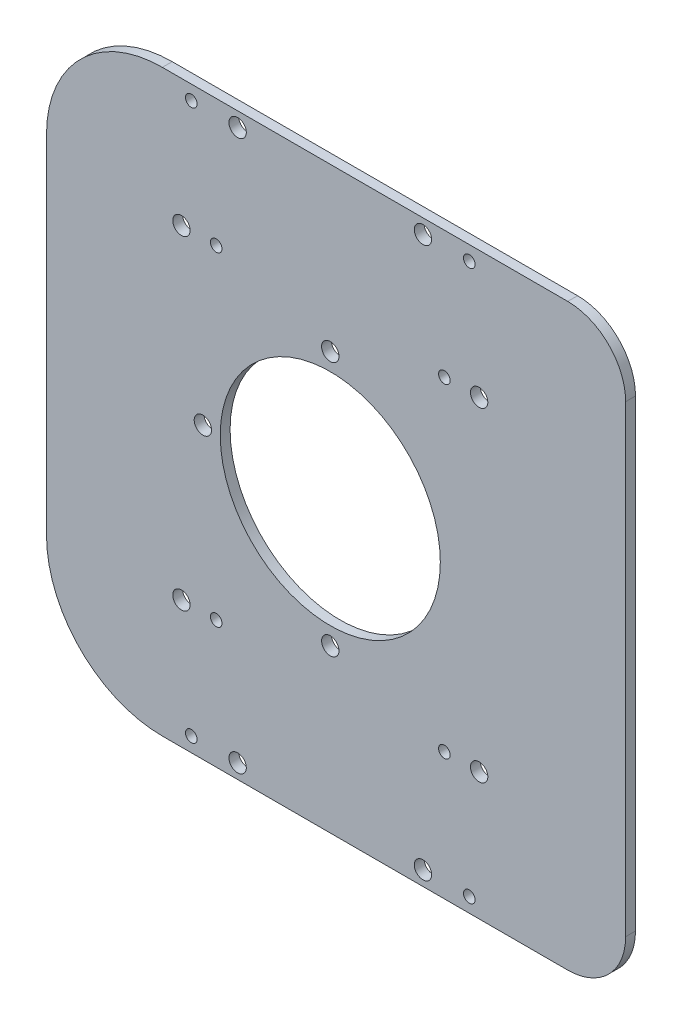
ISO-10303-21;
HEADER;
FILE_DESCRIPTION(('STEP AP214'),'2;1');
FILE_NAME('part.step','',(''),(''),'','','');
FILE_SCHEMA(('AUTOMOTIVE_DESIGN { 1 0 10303 214 1 1 1 1 }'));
ENDSEC;
DATA;
#1=APPLICATION_CONTEXT('core data for automotive mechanical design processes');
#2=APPLICATION_PROTOCOL_DEFINITION('international standard','automotive_design',2000,#1);
#3=PRODUCT_CONTEXT('',#1,'mechanical');
#4=PRODUCT('Part','Part','',(#3));
#5=PRODUCT_RELATED_PRODUCT_CATEGORY('part','',(#4));
#6=PRODUCT_DEFINITION_FORMATION('','',#4);
#7=PRODUCT_DEFINITION_CONTEXT('part definition',#1,'design');
#8=PRODUCT_DEFINITION('design','',#6,#7);
#9=PRODUCT_DEFINITION_SHAPE('','',#8);
#10=(LENGTH_UNIT() NAMED_UNIT(*) SI_UNIT(.MILLI.,.METRE.));
#11=(NAMED_UNIT(*) PLANE_ANGLE_UNIT() SI_UNIT($,.RADIAN.));
#12=(NAMED_UNIT(*) SI_UNIT($,.STERADIAN.) SOLID_ANGLE_UNIT());
#13=UNCERTAINTY_MEASURE_WITH_UNIT(LENGTH_MEASURE(1.E-05),#10,'distance_accuracy_value','');
#14=(GEOMETRIC_REPRESENTATION_CONTEXT(3) GLOBAL_UNCERTAINTY_ASSIGNED_CONTEXT((#13)) GLOBAL_UNIT_ASSIGNED_CONTEXT((#10,
#11,#12)) REPRESENTATION_CONTEXT('',''));
#15=CARTESIAN_POINT('',(0.,0.,0.));
#16=DIRECTION('',(0.,0.,1.));
#17=DIRECTION('',(1.,0.,0.));
#18=AXIS2_PLACEMENT_3D('',#15,#16,#17);
#19=CARTESIAN_POINT('',(-29.,50.,3.));
#20=DIRECTION('',(0.,-1.,0.));
#21=DIRECTION('',(0.,0.,-1.));
#22=AXIS2_PLACEMENT_3D('',#19,#20,#21);
#23=PLANE('',#22);
#24=DIRECTION('',(1.,0.,0.));
#25=VECTOR('',#24,1.);
#26=CARTESIAN_POINT('',(-29.,50.,1.3));
#27=LINE('',#26,#25);
#28=CARTESIAN_POINT('',(-29.,50.,1.3));
#29=VERTEX_POINT('',#28);
#30=CARTESIAN_POINT('',(41.,50.,1.3));
#31=VERTEX_POINT('',#30);
#32=EDGE_CURVE('E112',#29,#31,#27,.T.);
#33=ORIENTED_EDGE('',*,*,#32,.F.);
#34=DIRECTION('',(0.,0.,1.));
#35=VECTOR('',#34,1.);
#36=CARTESIAN_POINT('',(-29.,50.,3.));
#37=LINE('',#36,#35);
#38=CARTESIAN_POINT('',(-29.,50.,3.));
#39=VERTEX_POINT('',#38);
#40=EDGE_CURVE('E125',#29,#39,#37,.T.);
#41=ORIENTED_EDGE('',*,*,#40,.T.);
#42=DIRECTION('',(-1.,0.,0.));
#43=VECTOR('',#42,1.);
#44=CARTESIAN_POINT('',(-29.,50.,3.));
#45=LINE('',#44,#43);
#46=CARTESIAN_POINT('',(41.,50.,3.));
#47=VERTEX_POINT('',#46);
#48=EDGE_CURVE('E142',#47,#39,#45,.T.);
#49=ORIENTED_EDGE('',*,*,#48,.F.);
#50=DIRECTION('',(0.,0.,1.));
#51=VECTOR('',#50,1.);
#52=CARTESIAN_POINT('',(41.,50.,3.));
#53=LINE('',#52,#51);
#54=EDGE_CURVE('E53',#47,#31,#53,.F.);
#55=ORIENTED_EDGE('',*,*,#54,.T.);
#56=EDGE_LOOP('',(#33,#41,#49,#55));
#57=FACE_BOUND('',#56,.T.);
#58=ADVANCED_FACE('F44',(#57),#23,.F.);
#59=CARTESIAN_POINT('',(-29.,-50.,3.));
#60=DIRECTION('',(0.,1.,0.));
#61=DIRECTION('',(0.,0.,1.));
#62=AXIS2_PLACEMENT_3D('',#59,#60,#61);
#63=PLANE('',#62);
#64=DIRECTION('',(-1.,0.,0.));
#65=VECTOR('',#64,1.);
#66=CARTESIAN_POINT('',(41.,-50.,1.3));
#67=LINE('',#66,#65);
#68=CARTESIAN_POINT('',(41.,-50.,1.3));
#69=VERTEX_POINT('',#68);
#70=CARTESIAN_POINT('',(-29.,-50.,1.3));
#71=VERTEX_POINT('',#70);
#72=EDGE_CURVE('E191',#69,#71,#67,.T.);
#73=ORIENTED_EDGE('',*,*,#72,.F.);
#74=DIRECTION('',(0.,0.,1.));
#75=VECTOR('',#74,1.);
#76=CARTESIAN_POINT('',(41.,-50.,3.));
#77=LINE('',#76,#75);
#78=CARTESIAN_POINT('',(41.,-50.,3.));
#79=VERTEX_POINT('',#78);
#80=EDGE_CURVE('E11',#69,#79,#77,.T.);
#81=ORIENTED_EDGE('',*,*,#80,.T.);
#82=DIRECTION('',(1.,0.,0.));
#83=VECTOR('',#82,1.);
#84=CARTESIAN_POINT('',(-29.,-50.,3.));
#85=LINE('',#84,#83);
#86=CARTESIAN_POINT('',(-29.,-50.,3.));
#87=VERTEX_POINT('',#86);
#88=EDGE_CURVE('E136',#87,#79,#85,.T.);
#89=ORIENTED_EDGE('',*,*,#88,.F.);
#90=DIRECTION('',(0.,0.,1.));
#91=VECTOR('',#90,1.);
#92=CARTESIAN_POINT('',(-29.,-50.,0.));
#93=LINE('',#92,#91);
#94=EDGE_CURVE('E154',#87,#71,#93,.F.);
#95=ORIENTED_EDGE('',*,*,#94,.T.);
#96=EDGE_LOOP('',(#73,#81,#89,#95));
#97=FACE_BOUND('',#96,.T.);
#98=ADVANCED_FACE('F384',(#97),#63,.F.);
#99=CARTESIAN_POINT('',(-24.,47.5,3.));
#100=DIRECTION('',(0.,0.,-1.));
#101=DIRECTION('',(-1.,0.,0.));
#102=AXIS2_PLACEMENT_3D('',#99,#100,#101);
#103=CYLINDRICAL_SURFACE('',#102,0.999999999999998);
#104=CARTESIAN_POINT('',(-24.,47.5,3.));
#105=DIRECTION('',(0.,0.,1.));
#106=DIRECTION('',(1.,0.,0.));
#107=AXIS2_PLACEMENT_3D('',#104,#105,#106);
#108=CIRCLE('',#107,0.999999999999998);
#109=CARTESIAN_POINT('',(-23.,47.5,3.));
#110=VERTEX_POINT('',#109);
#111=EDGE_CURVE('E181',#110,#110,#108,.T.);
#112=ORIENTED_EDGE('',*,*,#111,.T.);
#113=EDGE_LOOP('',(#112));
#114=FACE_BOUND('',#113,.T.);
#115=CARTESIAN_POINT('',(-24.,47.5,1.3));
#116=DIRECTION('',(0.,0.,-1.));
#117=DIRECTION('',(-1.,0.,0.));
#118=AXIS2_PLACEMENT_3D('',#115,#116,#117);
#119=CIRCLE('',#118,0.999999999999998);
#120=CARTESIAN_POINT('',(-25.,47.5,1.3));
#121=VERTEX_POINT('',#120);
#122=EDGE_CURVE('E275',#121,#121,#119,.T.);
#123=ORIENTED_EDGE('',*,*,#122,.T.);
#124=EDGE_LOOP('',(#123));
#125=FACE_BOUND('',#124,.T.);
#126=ADVANCED_FACE('F365',(#114,#125),#103,.F.);
#127=CARTESIAN_POINT('',(-16.,47.5,3.));
#128=DIRECTION('',(0.,0.,-1.));
#129=DIRECTION('',(-1.,0.,0.));
#130=AXIS2_PLACEMENT_3D('',#127,#128,#129);
#131=CYLINDRICAL_SURFACE('',#130,1.5);
#132=CARTESIAN_POINT('',(-16.,47.5,3.));
#133=DIRECTION('',(0.,0.,1.));
#134=DIRECTION('',(1.,0.,0.));
#135=AXIS2_PLACEMENT_3D('',#132,#133,#134);
#136=CIRCLE('',#135,1.5);
#137=CARTESIAN_POINT('',(-14.5,47.5,3.));
#138=VERTEX_POINT('',#137);
#139=EDGE_CURVE('E357',#138,#138,#136,.T.);
#140=ORIENTED_EDGE('',*,*,#139,.T.);
#141=EDGE_LOOP('',(#140));
#142=FACE_BOUND('',#141,.T.);
#143=CARTESIAN_POINT('',(-16.,47.5,1.3));
#144=DIRECTION('',(0.,0.,-1.));
#145=DIRECTION('',(-1.,0.,0.));
#146=AXIS2_PLACEMENT_3D('',#143,#144,#145);
#147=CIRCLE('',#146,1.5);
#148=CARTESIAN_POINT('',(-17.5,47.5,1.3));
#149=VERTEX_POINT('',#148);
#150=EDGE_CURVE('E271',#149,#149,#147,.T.);
#151=ORIENTED_EDGE('',*,*,#150,.T.);
#152=EDGE_LOOP('',(#151));
#153=FACE_BOUND('',#152,.T.);
#154=ADVANCED_FACE('F434',(#142,#153),#131,.F.);
#155=CARTESIAN_POINT('',(-16.,-47.5,3.));
#156=DIRECTION('',(0.,0.,-1.));
#157=DIRECTION('',(-1.,0.,0.));
#158=AXIS2_PLACEMENT_3D('',#155,#156,#157);
#159=CYLINDRICAL_SURFACE('',#158,1.5);
#160=CARTESIAN_POINT('',(-16.,-47.5,3.));
#161=DIRECTION('',(0.,0.,1.));
#162=DIRECTION('',(-1.,0.,0.));
#163=AXIS2_PLACEMENT_3D('',#160,#161,#162);
#164=CIRCLE('',#163,1.5);
#165=CARTESIAN_POINT('',(-17.5,-47.5,3.));
#166=VERTEX_POINT('',#165);
#167=EDGE_CURVE('E353',#166,#166,#164,.T.);
#168=ORIENTED_EDGE('',*,*,#167,.T.);
#169=EDGE_LOOP('',(#168));
#170=FACE_BOUND('',#169,.T.);
#171=CARTESIAN_POINT('',(-16.,-47.5,1.3));
#172=DIRECTION('',(0.,0.,-1.));
#173=DIRECTION('',(-1.,0.,0.));
#174=AXIS2_PLACEMENT_3D('',#171,#172,#173);
#175=CIRCLE('',#174,1.5);
#176=CARTESIAN_POINT('',(-17.5,-47.5,1.3));
#177=VERTEX_POINT('',#176);
#178=EDGE_CURVE('E267',#177,#177,#175,.T.);
#179=ORIENTED_EDGE('',*,*,#178,.T.);
#180=EDGE_LOOP('',(#179));
#181=FACE_BOUND('',#180,.T.);
#182=ADVANCED_FACE('F442',(#170,#181),#159,.F.);
#183=CARTESIAN_POINT('',(16.,47.5,3.));
#184=DIRECTION('',(0.,0.,-1.));
#185=DIRECTION('',(-1.,0.,0.));
#186=AXIS2_PLACEMENT_3D('',#183,#184,#185);
#187=CYLINDRICAL_SURFACE('',#186,1.5);
#188=CARTESIAN_POINT('',(16.,47.5,3.));
#189=DIRECTION('',(0.,0.,1.));
#190=DIRECTION('',(-1.,0.,0.));
#191=AXIS2_PLACEMENT_3D('',#188,#189,#190);
#192=CIRCLE('',#191,1.5);
#193=CARTESIAN_POINT('',(14.5,47.5,3.));
#194=VERTEX_POINT('',#193);
#195=EDGE_CURVE('E349',#194,#194,#192,.T.);
#196=ORIENTED_EDGE('',*,*,#195,.T.);
#197=EDGE_LOOP('',(#196));
#198=FACE_BOUND('',#197,.T.);
#199=CARTESIAN_POINT('',(16.,47.5,1.3));
#200=DIRECTION('',(0.,0.,-1.));
#201=DIRECTION('',(-1.,0.,0.));
#202=AXIS2_PLACEMENT_3D('',#199,#200,#201);
#203=CIRCLE('',#202,1.5);
#204=CARTESIAN_POINT('',(14.5,47.5,1.3));
#205=VERTEX_POINT('',#204);
#206=EDGE_CURVE('E263',#205,#205,#203,.T.);
#207=ORIENTED_EDGE('',*,*,#206,.T.);
#208=EDGE_LOOP('',(#207));
#209=FACE_BOUND('',#208,.T.);
#210=ADVANCED_FACE('F452',(#198,#209),#187,.F.);
#211=CARTESIAN_POINT('',(24.,47.5,3.));
#212=DIRECTION('',(0.,0.,-1.));
#213=DIRECTION('',(-1.,0.,0.));
#214=AXIS2_PLACEMENT_3D('',#211,#212,#213);
#215=CYLINDRICAL_SURFACE('',#214,0.999999999999998);
#216=CARTESIAN_POINT('',(24.,47.5,3.));
#217=DIRECTION('',(0.,0.,1.));
#218=DIRECTION('',(-1.,0.,0.));
#219=AXIS2_PLACEMENT_3D('',#216,#217,#218);
#220=CIRCLE('',#219,0.999999999999998);
#221=CARTESIAN_POINT('',(23.,47.5,3.));
#222=VERTEX_POINT('',#221);
#223=EDGE_CURVE('E345',#222,#222,#220,.T.);
#224=ORIENTED_EDGE('',*,*,#223,.T.);
#225=EDGE_LOOP('',(#224));
#226=FACE_BOUND('',#225,.T.);
#227=CARTESIAN_POINT('',(24.,47.5,1.3));
#228=DIRECTION('',(0.,0.,-1.));
#229=DIRECTION('',(-1.,0.,0.));
#230=AXIS2_PLACEMENT_3D('',#227,#228,#229);
#231=CIRCLE('',#230,0.999999999999998);
#232=CARTESIAN_POINT('',(23.,47.5,1.3));
#233=VERTEX_POINT('',#232);
#234=EDGE_CURVE('E259',#233,#233,#231,.T.);
#235=ORIENTED_EDGE('',*,*,#234,.T.);
#236=EDGE_LOOP('',(#235));
#237=FACE_BOUND('',#236,.T.);
#238=ADVANCED_FACE('F462',(#226,#237),#215,.F.);
#239=CARTESIAN_POINT('',(-19.7,28.,3.));
#240=DIRECTION('',(0.,0.,-1.));
#241=DIRECTION('',(-1.,0.,0.));
#242=AXIS2_PLACEMENT_3D('',#239,#240,#241);
#243=CYLINDRICAL_SURFACE('',#242,1.);
#244=CARTESIAN_POINT('',(-19.7,28.,3.));
#245=DIRECTION('',(0.,0.,1.));
#246=DIRECTION('',(1.,0.,0.));
#247=AXIS2_PLACEMENT_3D('',#244,#245,#246);
#248=CIRCLE('',#247,1.);
#249=CARTESIAN_POINT('',(-18.7,28.,3.));
#250=VERTEX_POINT('',#249);
#251=EDGE_CURVE('E341',#250,#250,#248,.T.);
#252=ORIENTED_EDGE('',*,*,#251,.T.);
#253=EDGE_LOOP('',(#252));
#254=FACE_BOUND('',#253,.T.);
#255=CARTESIAN_POINT('',(-19.7,28.,1.3));
#256=DIRECTION('',(0.,0.,-1.));
#257=DIRECTION('',(-1.,0.,0.));
#258=AXIS2_PLACEMENT_3D('',#255,#256,#257);
#259=CIRCLE('',#258,1.);
#260=CARTESIAN_POINT('',(-20.7,28.,1.3));
#261=VERTEX_POINT('',#260);
#262=EDGE_CURVE('E255',#261,#261,#259,.T.);
#263=ORIENTED_EDGE('',*,*,#262,.T.);
#264=EDGE_LOOP('',(#263));
#265=FACE_BOUND('',#264,.T.);
#266=ADVANCED_FACE('F472',(#254,#265),#243,.F.);
#267=CARTESIAN_POINT('',(-25.7,28.,3.));
#268=DIRECTION('',(0.,0.,-1.));
#269=DIRECTION('',(-1.,0.,0.));
#270=AXIS2_PLACEMENT_3D('',#267,#268,#269);
#271=CYLINDRICAL_SURFACE('',#270,1.5);
#272=CARTESIAN_POINT('',(-25.7,28.,3.));
#273=DIRECTION('',(0.,0.,1.));
#274=DIRECTION('',(1.,0.,0.));
#275=AXIS2_PLACEMENT_3D('',#272,#273,#274);
#276=CIRCLE('',#275,1.5);
#277=CARTESIAN_POINT('',(-24.2,28.,3.));
#278=VERTEX_POINT('',#277);
#279=EDGE_CURVE('E337',#278,#278,#276,.T.);
#280=ORIENTED_EDGE('',*,*,#279,.T.);
#281=EDGE_LOOP('',(#280));
#282=FACE_BOUND('',#281,.T.);
#283=CARTESIAN_POINT('',(-25.7,28.,1.3));
#284=DIRECTION('',(0.,0.,-1.));
#285=DIRECTION('',(-1.,0.,0.));
#286=AXIS2_PLACEMENT_3D('',#283,#284,#285);
#287=CIRCLE('',#286,1.5);
#288=CARTESIAN_POINT('',(-27.2,28.,1.3));
#289=VERTEX_POINT('',#288);
#290=EDGE_CURVE('E251',#289,#289,#287,.T.);
#291=ORIENTED_EDGE('',*,*,#290,.T.);
#292=EDGE_LOOP('',(#291));
#293=FACE_BOUND('',#292,.T.);
#294=ADVANCED_FACE('F482',(#282,#293),#271,.F.);
#295=CARTESIAN_POINT('',(19.7,28.,3.));
#296=DIRECTION('',(0.,0.,-1.));
#297=DIRECTION('',(-1.,0.,0.));
#298=AXIS2_PLACEMENT_3D('',#295,#296,#297);
#299=CYLINDRICAL_SURFACE('',#298,1.);
#300=CARTESIAN_POINT('',(19.7,28.,3.));
#301=DIRECTION('',(0.,0.,1.));
#302=DIRECTION('',(-1.,0.,0.));
#303=AXIS2_PLACEMENT_3D('',#300,#301,#302);
#304=CIRCLE('',#303,1.);
#305=CARTESIAN_POINT('',(18.7,28.,3.));
#306=VERTEX_POINT('',#305);
#307=EDGE_CURVE('E333',#306,#306,#304,.T.);
#308=ORIENTED_EDGE('',*,*,#307,.T.);
#309=EDGE_LOOP('',(#308));
#310=FACE_BOUND('',#309,.T.);
#311=CARTESIAN_POINT('',(19.7,28.,1.3));
#312=DIRECTION('',(0.,0.,-1.));
#313=DIRECTION('',(-1.,0.,0.));
#314=AXIS2_PLACEMENT_3D('',#311,#312,#313);
#315=CIRCLE('',#314,1.);
#316=CARTESIAN_POINT('',(18.7,28.,1.3));
#317=VERTEX_POINT('',#316);
#318=EDGE_CURVE('E247',#317,#317,#315,.T.);
#319=ORIENTED_EDGE('',*,*,#318,.T.);
#320=EDGE_LOOP('',(#319));
#321=FACE_BOUND('',#320,.T.);
#322=ADVANCED_FACE('F492',(#310,#321),#299,.F.);
#323=CARTESIAN_POINT('',(25.7,28.,3.));
#324=DIRECTION('',(0.,0.,-1.));
#325=DIRECTION('',(-1.,0.,0.));
#326=AXIS2_PLACEMENT_3D('',#323,#324,#325);
#327=CYLINDRICAL_SURFACE('',#326,1.5);
#328=CARTESIAN_POINT('',(25.7,28.,3.));
#329=DIRECTION('',(0.,0.,1.));
#330=DIRECTION('',(-1.,0.,0.));
#331=AXIS2_PLACEMENT_3D('',#328,#329,#330);
#332=CIRCLE('',#331,1.5);
#333=CARTESIAN_POINT('',(24.2,28.,3.));
#334=VERTEX_POINT('',#333);
#335=EDGE_CURVE('E329',#334,#334,#332,.T.);
#336=ORIENTED_EDGE('',*,*,#335,.T.);
#337=EDGE_LOOP('',(#336));
#338=FACE_BOUND('',#337,.T.);
#339=CARTESIAN_POINT('',(25.7,28.,1.3));
#340=DIRECTION('',(0.,0.,-1.));
#341=DIRECTION('',(-1.,0.,0.));
#342=AXIS2_PLACEMENT_3D('',#339,#340,#341);
#343=CIRCLE('',#342,1.5);
#344=CARTESIAN_POINT('',(24.2,28.,1.3));
#345=VERTEX_POINT('',#344);
#346=EDGE_CURVE('E243',#345,#345,#343,.T.);
#347=ORIENTED_EDGE('',*,*,#346,.T.);
#348=EDGE_LOOP('',(#347));
#349=FACE_BOUND('',#348,.T.);
#350=ADVANCED_FACE('F502',(#338,#349),#327,.F.);
#351=CARTESIAN_POINT('',(25.7,-28.,3.));
#352=DIRECTION('',(0.,0.,-1.));
#353=DIRECTION('',(-1.,0.,0.));
#354=AXIS2_PLACEMENT_3D('',#351,#352,#353);
#355=CYLINDRICAL_SURFACE('',#354,1.5);
#356=CARTESIAN_POINT('',(25.7,-28.,3.));
#357=DIRECTION('',(0.,0.,1.));
#358=DIRECTION('',(1.,0.,0.));
#359=AXIS2_PLACEMENT_3D('',#356,#357,#358);
#360=CIRCLE('',#359,1.5);
#361=CARTESIAN_POINT('',(27.2,-28.,3.));
#362=VERTEX_POINT('',#361);
#363=EDGE_CURVE('E325',#362,#362,#360,.T.);
#364=ORIENTED_EDGE('',*,*,#363,.T.);
#365=EDGE_LOOP('',(#364));
#366=FACE_BOUND('',#365,.T.);
#367=CARTESIAN_POINT('',(25.7,-28.,1.3));
#368=DIRECTION('',(0.,0.,-1.));
#369=DIRECTION('',(-1.,0.,0.));
#370=AXIS2_PLACEMENT_3D('',#367,#368,#369);
#371=CIRCLE('',#370,1.5);
#372=CARTESIAN_POINT('',(24.2,-28.,1.3));
#373=VERTEX_POINT('',#372);
#374=EDGE_CURVE('E239',#373,#373,#371,.T.);
#375=ORIENTED_EDGE('',*,*,#374,.T.);
#376=EDGE_LOOP('',(#375));
#377=FACE_BOUND('',#376,.T.);
#378=ADVANCED_FACE('F512',(#366,#377),#355,.F.);
#379=CARTESIAN_POINT('',(24.,-47.5,3.));
#380=DIRECTION('',(0.,0.,-1.));
#381=DIRECTION('',(-1.,0.,0.));
#382=AXIS2_PLACEMENT_3D('',#379,#380,#381);
#383=CYLINDRICAL_SURFACE('',#382,0.999999999999998);
#384=CARTESIAN_POINT('',(24.,-47.5,3.));
#385=DIRECTION('',(0.,0.,1.));
#386=DIRECTION('',(1.,0.,0.));
#387=AXIS2_PLACEMENT_3D('',#384,#385,#386);
#388=CIRCLE('',#387,0.999999999999998);
#389=CARTESIAN_POINT('',(25.,-47.5,3.));
#390=VERTEX_POINT('',#389);
#391=EDGE_CURVE('E321',#390,#390,#388,.T.);
#392=ORIENTED_EDGE('',*,*,#391,.T.);
#393=EDGE_LOOP('',(#392));
#394=FACE_BOUND('',#393,.T.);
#395=CARTESIAN_POINT('',(24.,-47.5,1.3));
#396=DIRECTION('',(0.,0.,-1.));
#397=DIRECTION('',(-1.,0.,0.));
#398=AXIS2_PLACEMENT_3D('',#395,#396,#397);
#399=CIRCLE('',#398,0.999999999999998);
#400=CARTESIAN_POINT('',(23.,-47.5,1.3));
#401=VERTEX_POINT('',#400);
#402=EDGE_CURVE('E235',#401,#401,#399,.T.);
#403=ORIENTED_EDGE('',*,*,#402,.T.);
#404=EDGE_LOOP('',(#403));
#405=FACE_BOUND('',#404,.T.);
#406=ADVANCED_FACE('F522',(#394,#405),#383,.F.);
#407=CARTESIAN_POINT('',(16.,-47.5,3.));
#408=DIRECTION('',(0.,0.,-1.));
#409=DIRECTION('',(-1.,0.,0.));
#410=AXIS2_PLACEMENT_3D('',#407,#408,#409);
#411=CYLINDRICAL_SURFACE('',#410,1.5);
#412=CARTESIAN_POINT('',(16.,-47.5,3.));
#413=DIRECTION('',(0.,0.,1.));
#414=DIRECTION('',(1.,0.,0.));
#415=AXIS2_PLACEMENT_3D('',#412,#413,#414);
#416=CIRCLE('',#415,1.5);
#417=CARTESIAN_POINT('',(17.5,-47.5,3.));
#418=VERTEX_POINT('',#417);
#419=EDGE_CURVE('E317',#418,#418,#416,.T.);
#420=ORIENTED_EDGE('',*,*,#419,.T.);
#421=EDGE_LOOP('',(#420));
#422=FACE_BOUND('',#421,.T.);
#423=CARTESIAN_POINT('',(16.,-47.5,1.3));
#424=DIRECTION('',(0.,0.,-1.));
#425=DIRECTION('',(-1.,0.,0.));
#426=AXIS2_PLACEMENT_3D('',#423,#424,#425);
#427=CIRCLE('',#426,1.5);
#428=CARTESIAN_POINT('',(14.5,-47.5,1.3));
#429=VERTEX_POINT('',#428);
#430=EDGE_CURVE('E231',#429,#429,#427,.T.);
#431=ORIENTED_EDGE('',*,*,#430,.T.);
#432=EDGE_LOOP('',(#431));
#433=FACE_BOUND('',#432,.T.);
#434=ADVANCED_FACE('F532',(#422,#433),#411,.F.);
#435=CARTESIAN_POINT('',(19.7,-28.,3.));
#436=DIRECTION('',(0.,0.,-1.));
#437=DIRECTION('',(-1.,0.,0.));
#438=AXIS2_PLACEMENT_3D('',#435,#436,#437);
#439=CYLINDRICAL_SURFACE('',#438,1.);
#440=CARTESIAN_POINT('',(19.7,-28.,3.));
#441=DIRECTION('',(0.,0.,1.));
#442=DIRECTION('',(1.,0.,0.));
#443=AXIS2_PLACEMENT_3D('',#440,#441,#442);
#444=CIRCLE('',#443,1.);
#445=CARTESIAN_POINT('',(20.7,-28.,3.));
#446=VERTEX_POINT('',#445);
#447=EDGE_CURVE('E313',#446,#446,#444,.T.);
#448=ORIENTED_EDGE('',*,*,#447,.T.);
#449=EDGE_LOOP('',(#448));
#450=FACE_BOUND('',#449,.T.);
#451=CARTESIAN_POINT('',(19.7,-28.,1.3));
#452=DIRECTION('',(0.,0.,-1.));
#453=DIRECTION('',(-1.,0.,0.));
#454=AXIS2_PLACEMENT_3D('',#451,#452,#453);
#455=CIRCLE('',#454,1.);
#456=CARTESIAN_POINT('',(18.7,-28.,1.3));
#457=VERTEX_POINT('',#456);
#458=EDGE_CURVE('E227',#457,#457,#455,.T.);
#459=ORIENTED_EDGE('',*,*,#458,.T.);
#460=EDGE_LOOP('',(#459));
#461=FACE_BOUND('',#460,.T.);
#462=ADVANCED_FACE('F542',(#450,#461),#439,.F.);
#463=CARTESIAN_POINT('',(-19.7,-28.,3.));
#464=DIRECTION('',(0.,0.,-1.));
#465=DIRECTION('',(-1.,0.,0.));
#466=AXIS2_PLACEMENT_3D('',#463,#464,#465);
#467=CYLINDRICAL_SURFACE('',#466,1.);
#468=CARTESIAN_POINT('',(-19.7,-28.,3.));
#469=DIRECTION('',(0.,0.,1.));
#470=DIRECTION('',(-1.,0.,0.));
#471=AXIS2_PLACEMENT_3D('',#468,#469,#470);
#472=CIRCLE('',#471,1.);
#473=CARTESIAN_POINT('',(-20.7,-28.,3.));
#474=VERTEX_POINT('',#473);
#475=EDGE_CURVE('E309',#474,#474,#472,.T.);
#476=ORIENTED_EDGE('',*,*,#475,.T.);
#477=EDGE_LOOP('',(#476));
#478=FACE_BOUND('',#477,.T.);
#479=CARTESIAN_POINT('',(-19.7,-28.,1.3));
#480=DIRECTION('',(0.,0.,-1.));
#481=DIRECTION('',(-1.,0.,0.));
#482=AXIS2_PLACEMENT_3D('',#479,#480,#481);
#483=CIRCLE('',#482,1.);
#484=CARTESIAN_POINT('',(-20.7,-28.,1.3));
#485=VERTEX_POINT('',#484);
#486=EDGE_CURVE('E223',#485,#485,#483,.T.);
#487=ORIENTED_EDGE('',*,*,#486,.T.);
#488=EDGE_LOOP('',(#487));
#489=FACE_BOUND('',#488,.T.);
#490=ADVANCED_FACE('F552',(#478,#489),#467,.F.);
#491=CARTESIAN_POINT('',(-25.7,-28.,3.));
#492=DIRECTION('',(0.,0.,-1.));
#493=DIRECTION('',(-1.,0.,0.));
#494=AXIS2_PLACEMENT_3D('',#491,#492,#493);
#495=CYLINDRICAL_SURFACE('',#494,1.5);
#496=CARTESIAN_POINT('',(-25.7,-28.,3.));
#497=DIRECTION('',(0.,0.,1.));
#498=DIRECTION('',(-1.,0.,0.));
#499=AXIS2_PLACEMENT_3D('',#496,#497,#498);
#500=CIRCLE('',#499,1.5);
#501=CARTESIAN_POINT('',(-27.2,-28.,3.));
#502=VERTEX_POINT('',#501);
#503=EDGE_CURVE('E305',#502,#502,#500,.T.);
#504=ORIENTED_EDGE('',*,*,#503,.T.);
#505=EDGE_LOOP('',(#504));
#506=FACE_BOUND('',#505,.T.);
#507=CARTESIAN_POINT('',(-25.7,-28.,1.3));
#508=DIRECTION('',(0.,0.,-1.));
#509=DIRECTION('',(-1.,0.,0.));
#510=AXIS2_PLACEMENT_3D('',#507,#508,#509);
#511=CIRCLE('',#510,1.5);
#512=CARTESIAN_POINT('',(-27.2,-28.,1.3));
#513=VERTEX_POINT('',#512);
#514=EDGE_CURVE('E219',#513,#513,#511,.T.);
#515=ORIENTED_EDGE('',*,*,#514,.T.);
#516=EDGE_LOOP('',(#515));
#517=FACE_BOUND('',#516,.T.);
#518=ADVANCED_FACE('F562',(#506,#517),#495,.F.);
#519=CARTESIAN_POINT('',(-24.,-47.5,3.));
#520=DIRECTION('',(0.,0.,-1.));
#521=DIRECTION('',(-1.,0.,0.));
#522=AXIS2_PLACEMENT_3D('',#519,#520,#521);
#523=CYLINDRICAL_SURFACE('',#522,0.999999999999998);
#524=CARTESIAN_POINT('',(-24.,-47.5,3.));
#525=DIRECTION('',(0.,0.,1.));
#526=DIRECTION('',(-1.,0.,0.));
#527=AXIS2_PLACEMENT_3D('',#524,#525,#526);
#528=CIRCLE('',#527,0.999999999999998);
#529=CARTESIAN_POINT('',(-25.,-47.5,3.));
#530=VERTEX_POINT('',#529);
#531=EDGE_CURVE('E290',#530,#530,#528,.T.);
#532=ORIENTED_EDGE('',*,*,#531,.T.);
#533=EDGE_LOOP('',(#532));
#534=FACE_BOUND('',#533,.T.);
#535=CARTESIAN_POINT('',(-24.,-47.5,1.3));
#536=DIRECTION('',(0.,0.,-1.));
#537=DIRECTION('',(-1.,0.,0.));
#538=AXIS2_PLACEMENT_3D('',#535,#536,#537);
#539=CIRCLE('',#538,0.999999999999998);
#540=CARTESIAN_POINT('',(-25.,-47.5,1.3));
#541=VERTEX_POINT('',#540);
#542=EDGE_CURVE('E215',#541,#541,#539,.T.);
#543=ORIENTED_EDGE('',*,*,#542,.T.);
#544=EDGE_LOOP('',(#543));
#545=FACE_BOUND('',#544,.T.);
#546=ADVANCED_FACE('F572',(#534,#545),#523,.F.);
#547=CARTESIAN_POINT('',(-22.,0.,-7.));
#548=DIRECTION('',(0.,0.,1.));
#549=DIRECTION('',(1.,0.,0.));
#550=AXIS2_PLACEMENT_3D('',#547,#548,#549);
#551=CYLINDRICAL_SURFACE('',#550,1.5);
#552=CARTESIAN_POINT('',(-22.,0.,3.));
#553=DIRECTION('',(0.,0.,1.));
#554=DIRECTION('',(1.,0.,0.));
#555=AXIS2_PLACEMENT_3D('',#552,#553,#554);
#556=CIRCLE('',#555,1.5);
#557=CARTESIAN_POINT('',(-20.5,0.,3.));
#558=VERTEX_POINT('',#557);
#559=EDGE_CURVE('E291',#558,#558,#556,.T.);
#560=ORIENTED_EDGE('',*,*,#559,.T.);
#561=EDGE_LOOP('',(#560));
#562=FACE_BOUND('',#561,.T.);
#563=CARTESIAN_POINT('',(-22.,0.,1.3));
#564=DIRECTION('',(0.,0.,-1.));
#565=DIRECTION('',(-1.,0.,0.));
#566=AXIS2_PLACEMENT_3D('',#563,#564,#565);
#567=CIRCLE('',#566,1.5);
#568=CARTESIAN_POINT('',(-23.5,0.,1.3));
#569=VERTEX_POINT('',#568);
#570=EDGE_CURVE('E211',#569,#569,#567,.F.);
#571=ORIENTED_EDGE('',*,*,#570,.F.);
#572=EDGE_LOOP('',(#571));
#573=FACE_BOUND('',#572,.T.);
#574=ADVANCED_FACE('F582',(#562,#573),#551,.F.);
#575=CARTESIAN_POINT('',(0.,22.,-7.));
#576=DIRECTION('',(0.,0.,1.));
#577=DIRECTION('',(1.,0.,0.));
#578=AXIS2_PLACEMENT_3D('',#575,#576,#577);
#579=CYLINDRICAL_SURFACE('',#578,1.5);
#580=CARTESIAN_POINT('',(0.,22.,3.));
#581=DIRECTION('',(0.,0.,1.));
#582=DIRECTION('',(1.,0.,0.));
#583=AXIS2_PLACEMENT_3D('',#580,#581,#582);
#584=CIRCLE('',#583,1.5);
#585=CARTESIAN_POINT('',(1.5,22.,3.));
#586=VERTEX_POINT('',#585);
#587=EDGE_CURVE('E295',#586,#586,#584,.T.);
#588=ORIENTED_EDGE('',*,*,#587,.T.);
#589=EDGE_LOOP('',(#588));
#590=FACE_BOUND('',#589,.T.);
#591=CARTESIAN_POINT('',(0.,22.,1.3));
#592=DIRECTION('',(0.,0.,-1.));
#593=DIRECTION('',(-1.,0.,0.));
#594=AXIS2_PLACEMENT_3D('',#591,#592,#593);
#595=CIRCLE('',#594,1.5);
#596=CARTESIAN_POINT('',(-1.5,22.,1.3));
#597=VERTEX_POINT('',#596);
#598=EDGE_CURVE('E207',#597,#597,#595,.F.);
#599=ORIENTED_EDGE('',*,*,#598,.F.);
#600=EDGE_LOOP('',(#599));
#601=FACE_BOUND('',#600,.T.);
#602=ADVANCED_FACE('F592',(#590,#601),#579,.F.);
#603=CARTESIAN_POINT('',(0.,0.,-7.));
#604=DIRECTION('',(0.,0.,1.));
#605=DIRECTION('',(1.,0.,0.));
#606=AXIS2_PLACEMENT_3D('',#603,#604,#605);
#607=CYLINDRICAL_SURFACE('',#606,19.);
#608=CARTESIAN_POINT('',(0.,0.,3.));
#609=DIRECTION('',(0.,0.,1.));
#610=DIRECTION('',(1.,0.,0.));
#611=AXIS2_PLACEMENT_3D('',#608,#609,#610);
#612=CIRCLE('',#611,19.);
#613=CARTESIAN_POINT('',(19.,0.,3.));
#614=VERTEX_POINT('',#613);
#615=EDGE_CURVE('E285',#614,#614,#612,.T.);
#616=ORIENTED_EDGE('',*,*,#615,.T.);
#617=EDGE_LOOP('',(#616));
#618=FACE_BOUND('',#617,.T.);
#619=CARTESIAN_POINT('',(0.,0.,1.3));
#620=DIRECTION('',(0.,0.,-1.));
#621=DIRECTION('',(-1.,0.,0.));
#622=AXIS2_PLACEMENT_3D('',#619,#620,#621);
#623=CIRCLE('',#622,19.);
#624=CARTESIAN_POINT('',(-19.,0.,1.3));
#625=VERTEX_POINT('',#624);
#626=EDGE_CURVE('E203',#625,#625,#623,.F.);
#627=ORIENTED_EDGE('',*,*,#626,.F.);
#628=EDGE_LOOP('',(#627));
#629=FACE_BOUND('',#628,.T.);
#630=ADVANCED_FACE('F602',(#618,#629),#607,.F.);
#631=CARTESIAN_POINT('',(0.,-22.,-7.));
#632=DIRECTION('',(0.,0.,1.));
#633=DIRECTION('',(1.,0.,0.));
#634=AXIS2_PLACEMENT_3D('',#631,#632,#633);
#635=CYLINDRICAL_SURFACE('',#634,1.5);
#636=CARTESIAN_POINT('',(0.,-22.,3.));
#637=DIRECTION('',(0.,0.,1.));
#638=DIRECTION('',(1.,0.,0.));
#639=AXIS2_PLACEMENT_3D('',#636,#637,#638);
#640=CIRCLE('',#639,1.5);
#641=CARTESIAN_POINT('',(1.5,-22.,3.));
#642=VERTEX_POINT('',#641);
#643=EDGE_CURVE('E286',#642,#642,#640,.T.);
#644=ORIENTED_EDGE('',*,*,#643,.T.);
#645=EDGE_LOOP('',(#644));
#646=FACE_BOUND('',#645,.T.);
#647=CARTESIAN_POINT('',(0.,-22.,1.3));
#648=DIRECTION('',(0.,0.,-1.));
#649=DIRECTION('',(-1.,0.,0.));
#650=AXIS2_PLACEMENT_3D('',#647,#648,#649);
#651=CIRCLE('',#650,1.5);
#652=CARTESIAN_POINT('',(-1.5,-22.,1.3));
#653=VERTEX_POINT('',#652);
#654=EDGE_CURVE('E199',#653,#653,#651,.F.);
#655=ORIENTED_EDGE('',*,*,#654,.F.);
#656=EDGE_LOOP('',(#655));
#657=FACE_BOUND('',#656,.T.);
#658=ADVANCED_FACE('F612',(#646,#657),#635,.F.);
#659=CARTESIAN_POINT('',(-49.,0.,0.));
#660=DIRECTION('',(-1.,0.,0.));
#661=DIRECTION('',(0.,-1.,0.));
#662=AXIS2_PLACEMENT_3D('',#659,#660,#661);
#663=PLANE('',#662);
#664=DIRECTION('',(0.,0.,1.));
#665=VECTOR('',#664,1.);
#666=CARTESIAN_POINT('',(-49.,30.,0.));
#667=LINE('',#666,#665);
#668=CARTESIAN_POINT('',(-49.,30.,3.));
#669=VERTEX_POINT('',#668);
#670=CARTESIAN_POINT('',(-49.,30.,1.3));
#671=VERTEX_POINT('',#670);
#672=EDGE_CURVE('E151',#669,#671,#667,.F.);
#673=ORIENTED_EDGE('',*,*,#672,.T.);
#674=DIRECTION('',(0.,1.,0.));
#675=VECTOR('',#674,1.);
#676=CARTESIAN_POINT('',(-49.,-30.,1.3));
#677=LINE('',#676,#675);
#678=CARTESIAN_POINT('',(-49.,-30.,1.3));
#679=VERTEX_POINT('',#678);
#680=EDGE_CURVE('E115',#679,#671,#677,.T.);
#681=ORIENTED_EDGE('',*,*,#680,.F.);
#682=DIRECTION('',(0.,0.,1.));
#683=VECTOR('',#682,1.);
#684=CARTESIAN_POINT('',(-49.,-30.,3.));
#685=LINE('',#684,#683);
#686=CARTESIAN_POINT('',(-49.,-30.,3.));
#687=VERTEX_POINT('',#686);
#688=EDGE_CURVE('E148',#679,#687,#685,.T.);
#689=ORIENTED_EDGE('',*,*,#688,.T.);
#690=DIRECTION('',(0.,-1.,0.));
#691=VECTOR('',#690,1.);
#692=CARTESIAN_POINT('',(-49.,0.,3.));
#693=LINE('',#692,#691);
#694=EDGE_CURVE('E281',#669,#687,#693,.T.);
#695=ORIENTED_EDGE('',*,*,#694,.F.);
#696=EDGE_LOOP('',(#673,#681,#689,#695));
#697=FACE_BOUND('',#696,.T.);
#698=ADVANCED_FACE('F622',(#697),#663,.T.);
#699=CARTESIAN_POINT('',(51.,0.,0.));
#700=DIRECTION('',(-1.,0.,0.));
#701=DIRECTION('',(0.,-1.,0.));
#702=AXIS2_PLACEMENT_3D('',#699,#700,#701);
#703=PLANE('',#702);
#704=DIRECTION('',(0.,-1.,0.));
#705=VECTOR('',#704,1.);
#706=CARTESIAN_POINT('',(51.,40.,1.3));
#707=LINE('',#706,#705);
#708=CARTESIAN_POINT('',(51.,40.,1.3));
#709=VERTEX_POINT('',#708);
#710=CARTESIAN_POINT('',(51.,-40.,1.3));
#711=VERTEX_POINT('',#710);
#712=EDGE_CURVE('E60',#709,#711,#707,.T.);
#713=ORIENTED_EDGE('',*,*,#712,.F.);
#714=DIRECTION('',(0.,0.,1.));
#715=VECTOR('',#714,1.);
#716=CARTESIAN_POINT('',(51.,40.,0.));
#717=LINE('',#716,#715);
#718=CARTESIAN_POINT('',(51.,40.,3.));
#719=VERTEX_POINT('',#718);
#720=EDGE_CURVE('E162',#709,#719,#717,.T.);
#721=ORIENTED_EDGE('',*,*,#720,.T.);
#722=DIRECTION('',(0.,-1.,0.));
#723=VECTOR('',#722,1.);
#724=CARTESIAN_POINT('',(51.,0.,3.));
#725=LINE('',#724,#723);
#726=CARTESIAN_POINT('',(51.,-40.,3.));
#727=VERTEX_POINT('',#726);
#728=EDGE_CURVE('E177',#719,#727,#725,.T.);
#729=ORIENTED_EDGE('',*,*,#728,.T.);
#730=DIRECTION('',(0.,0.,1.));
#731=VECTOR('',#730,1.);
#732=CARTESIAN_POINT('',(51.,-40.,0.));
#733=LINE('',#732,#731);
#734=EDGE_CURVE('E158',#727,#711,#733,.F.);
#735=ORIENTED_EDGE('',*,*,#734,.T.);
#736=EDGE_LOOP('',(#713,#721,#729,#735));
#737=FACE_BOUND('',#736,.T.);
#738=ADVANCED_FACE('F393',(#737),#703,.F.);
#739=CARTESIAN_POINT('',(-29.,30.,3.));
#740=DIRECTION('',(0.,0.,-1.));
#741=DIRECTION('',(-1.,0.,0.));
#742=AXIS2_PLACEMENT_3D('',#739,#740,#741);
#743=CYLINDRICAL_SURFACE('',#742,20.);
#744=ORIENTED_EDGE('',*,*,#40,.F.);
#745=CARTESIAN_POINT('',(-29.,30.,1.3));
#746=DIRECTION('',(0.,0.,-1.));
#747=DIRECTION('',(-1.,0.,0.));
#748=AXIS2_PLACEMENT_3D('',#745,#746,#747);
#749=CIRCLE('',#748,20.);
#750=EDGE_CURVE('E108',#671,#29,#749,.T.);
#751=ORIENTED_EDGE('',*,*,#750,.F.);
#752=ORIENTED_EDGE('',*,*,#672,.F.);
#753=CARTESIAN_POINT('',(-29.,30.,3.));
#754=DIRECTION('',(0.,0.,1.));
#755=DIRECTION('',(1.,0.,0.));
#756=AXIS2_PLACEMENT_3D('',#753,#754,#755);
#757=CIRCLE('',#756,20.);
#758=EDGE_CURVE('E133',#39,#669,#757,.T.);
#759=ORIENTED_EDGE('',*,*,#758,.F.);
#760=EDGE_LOOP('',(#744,#751,#752,#759));
#761=FACE_BOUND('',#760,.T.);
#762=ADVANCED_FACE('F132',(#761),#743,.T.);
#763=CARTESIAN_POINT('',(-29.,-30.,0.));
#764=DIRECTION('',(0.,0.,-1.));
#765=DIRECTION('',(-1.,0.,0.));
#766=AXIS2_PLACEMENT_3D('',#763,#764,#765);
#767=CYLINDRICAL_SURFACE('',#766,20.);
#768=ORIENTED_EDGE('',*,*,#688,.F.);
#769=CARTESIAN_POINT('',(-29.,-30.,1.3));
#770=DIRECTION('',(0.,0.,-1.));
#771=DIRECTION('',(-1.,0.,0.));
#772=AXIS2_PLACEMENT_3D('',#769,#770,#771);
#773=CIRCLE('',#772,20.);
#774=EDGE_CURVE('E194',#71,#679,#773,.T.);
#775=ORIENTED_EDGE('',*,*,#774,.F.);
#776=ORIENTED_EDGE('',*,*,#94,.F.);
#777=CARTESIAN_POINT('',(-29.,-30.,3.));
#778=DIRECTION('',(0.,0.,1.));
#779=DIRECTION('',(1.,0.,0.));
#780=AXIS2_PLACEMENT_3D('',#777,#778,#779);
#781=CIRCLE('',#780,20.);
#782=EDGE_CURVE('E135',#687,#87,#781,.T.);
#783=ORIENTED_EDGE('',*,*,#782,.F.);
#784=EDGE_LOOP('',(#768,#775,#776,#783));
#785=FACE_BOUND('',#784,.T.);
#786=ADVANCED_FACE('F392',(#785),#767,.T.);
#787=CARTESIAN_POINT('',(41.,40.,0.));
#788=DIRECTION('',(0.,0.,1.));
#789=DIRECTION('',(1.,0.,0.));
#790=AXIS2_PLACEMENT_3D('',#787,#788,#789);
#791=CYLINDRICAL_SURFACE('',#790,10.);
#792=ORIENTED_EDGE('',*,*,#720,.F.);
#793=CARTESIAN_POINT('',(41.,40.,1.3));
#794=DIRECTION('',(0.,0.,-1.));
#795=DIRECTION('',(-1.,0.,0.));
#796=AXIS2_PLACEMENT_3D('',#793,#794,#795);
#797=CIRCLE('',#796,10.);
#798=EDGE_CURVE('E129',#31,#709,#797,.T.);
#799=ORIENTED_EDGE('',*,*,#798,.F.);
#800=ORIENTED_EDGE('',*,*,#54,.F.);
#801=CARTESIAN_POINT('',(41.,40.,3.));
#802=DIRECTION('',(0.,0.,1.));
#803=DIRECTION('',(1.,0.,0.));
#804=AXIS2_PLACEMENT_3D('',#801,#802,#803);
#805=CIRCLE('',#804,10.);
#806=EDGE_CURVE('E168',#719,#47,#805,.T.);
#807=ORIENTED_EDGE('',*,*,#806,.F.);
#808=EDGE_LOOP('',(#792,#799,#800,#807));
#809=FACE_BOUND('',#808,.T.);
#810=ADVANCED_FACE('F182',(#809),#791,.T.);
#811=CARTESIAN_POINT('',(41.,-40.,3.));
#812=DIRECTION('',(0.,0.,1.));
#813=DIRECTION('',(1.,0.,0.));
#814=AXIS2_PLACEMENT_3D('',#811,#812,#813);
#815=CYLINDRICAL_SURFACE('',#814,10.);
#816=ORIENTED_EDGE('',*,*,#80,.F.);
#817=CARTESIAN_POINT('',(41.,-40.,1.3));
#818=DIRECTION('',(0.,0.,-1.));
#819=DIRECTION('',(-1.,0.,0.));
#820=AXIS2_PLACEMENT_3D('',#817,#818,#819);
#821=CIRCLE('',#820,10.);
#822=EDGE_CURVE('E186',#711,#69,#821,.T.);
#823=ORIENTED_EDGE('',*,*,#822,.F.);
#824=ORIENTED_EDGE('',*,*,#734,.F.);
#825=CARTESIAN_POINT('',(41.,-40.,3.));
#826=DIRECTION('',(0.,0.,1.));
#827=DIRECTION('',(1.,0.,0.));
#828=AXIS2_PLACEMENT_3D('',#825,#826,#827);
#829=CIRCLE('',#828,10.);
#830=EDGE_CURVE('E165',#79,#727,#829,.T.);
#831=ORIENTED_EDGE('',*,*,#830,.F.);
#832=EDGE_LOOP('',(#816,#823,#824,#831));
#833=FACE_BOUND('',#832,.T.);
#834=ADVANCED_FACE('F46',(#833),#815,.T.);
#835=CARTESIAN_POINT('',(0.,0.,3.));
#836=DIRECTION('',(0.,0.,1.));
#837=DIRECTION('',(1.,0.,0.));
#838=AXIS2_PLACEMENT_3D('',#835,#836,#837);
#839=PLANE('',#838);
#840=ORIENTED_EDGE('',*,*,#643,.F.);
#841=EDGE_LOOP('',(#840));
#842=FACE_BOUND('',#841,.T.);
#843=ORIENTED_EDGE('',*,*,#615,.F.);
#844=EDGE_LOOP('',(#843));
#845=FACE_BOUND('',#844,.T.);
#846=ORIENTED_EDGE('',*,*,#587,.F.);
#847=EDGE_LOOP('',(#846));
#848=FACE_BOUND('',#847,.T.);
#849=ORIENTED_EDGE('',*,*,#559,.F.);
#850=EDGE_LOOP('',(#849));
#851=FACE_BOUND('',#850,.T.);
#852=ORIENTED_EDGE('',*,*,#503,.F.);
#853=EDGE_LOOP('',(#852));
#854=FACE_BOUND('',#853,.T.);
#855=ORIENTED_EDGE('',*,*,#447,.F.);
#856=EDGE_LOOP('',(#855));
#857=FACE_BOUND('',#856,.T.);
#858=ORIENTED_EDGE('',*,*,#391,.F.);
#859=EDGE_LOOP('',(#858));
#860=FACE_BOUND('',#859,.T.);
#861=ORIENTED_EDGE('',*,*,#335,.F.);
#862=EDGE_LOOP('',(#861));
#863=FACE_BOUND('',#862,.T.);
#864=ORIENTED_EDGE('',*,*,#279,.F.);
#865=EDGE_LOOP('',(#864));
#866=FACE_BOUND('',#865,.T.);
#867=ORIENTED_EDGE('',*,*,#223,.F.);
#868=EDGE_LOOP('',(#867));
#869=FACE_BOUND('',#868,.T.);
#870=ORIENTED_EDGE('',*,*,#167,.F.);
#871=EDGE_LOOP('',(#870));
#872=FACE_BOUND('',#871,.T.);
#873=ORIENTED_EDGE('',*,*,#111,.F.);
#874=EDGE_LOOP('',(#873));
#875=FACE_BOUND('',#874,.T.);
#876=ORIENTED_EDGE('',*,*,#728,.F.);
#877=ORIENTED_EDGE('',*,*,#806,.T.);
#878=ORIENTED_EDGE('',*,*,#48,.T.);
#879=ORIENTED_EDGE('',*,*,#758,.T.);
#880=ORIENTED_EDGE('',*,*,#694,.T.);
#881=ORIENTED_EDGE('',*,*,#782,.T.);
#882=ORIENTED_EDGE('',*,*,#88,.T.);
#883=ORIENTED_EDGE('',*,*,#830,.T.);
#884=EDGE_LOOP('',(#876,#877,#878,#879,#880,#881,#882,#883));
#885=FACE_BOUND('',#884,.T.);
#886=ORIENTED_EDGE('',*,*,#139,.F.);
#887=EDGE_LOOP('',(#886));
#888=FACE_BOUND('',#887,.T.);
#889=ORIENTED_EDGE('',*,*,#195,.F.);
#890=EDGE_LOOP('',(#889));
#891=FACE_BOUND('',#890,.T.);
#892=ORIENTED_EDGE('',*,*,#251,.F.);
#893=EDGE_LOOP('',(#892));
#894=FACE_BOUND('',#893,.T.);
#895=ORIENTED_EDGE('',*,*,#307,.F.);
#896=EDGE_LOOP('',(#895));
#897=FACE_BOUND('',#896,.T.);
#898=ORIENTED_EDGE('',*,*,#363,.F.);
#899=EDGE_LOOP('',(#898));
#900=FACE_BOUND('',#899,.T.);
#901=ORIENTED_EDGE('',*,*,#419,.F.);
#902=EDGE_LOOP('',(#901));
#903=FACE_BOUND('',#902,.T.);
#904=ORIENTED_EDGE('',*,*,#475,.F.);
#905=EDGE_LOOP('',(#904));
#906=FACE_BOUND('',#905,.T.);
#907=ORIENTED_EDGE('',*,*,#531,.F.);
#908=EDGE_LOOP('',(#907));
#909=FACE_BOUND('',#908,.T.);
#910=ADVANCED_FACE('F174',(#842,#845,#848,#851,#854,#857,#860,#863,#866,#869,#872,#875,#885,
#888,#891,#894,#897,#900,#903,#906,#909),#839,.T.);
#911=CARTESIAN_POINT('',(-29.,30.,1.3));
#912=DIRECTION('',(0.,0.,-1.));
#913=DIRECTION('',(-1.,0.,0.));
#914=AXIS2_PLACEMENT_3D('',#911,#912,#913);
#915=PLANE('',#914);
#916=ORIENTED_EDGE('',*,*,#122,.F.);
#917=EDGE_LOOP('',(#916));
#918=FACE_BOUND('',#917,.T.);
#919=ORIENTED_EDGE('',*,*,#150,.F.);
#920=EDGE_LOOP('',(#919));
#921=FACE_BOUND('',#920,.T.);
#922=ORIENTED_EDGE('',*,*,#178,.F.);
#923=EDGE_LOOP('',(#922));
#924=FACE_BOUND('',#923,.T.);
#925=ORIENTED_EDGE('',*,*,#206,.F.);
#926=EDGE_LOOP('',(#925));
#927=FACE_BOUND('',#926,.T.);
#928=ORIENTED_EDGE('',*,*,#234,.F.);
#929=EDGE_LOOP('',(#928));
#930=FACE_BOUND('',#929,.T.);
#931=ORIENTED_EDGE('',*,*,#262,.F.);
#932=EDGE_LOOP('',(#931));
#933=FACE_BOUND('',#932,.T.);
#934=ORIENTED_EDGE('',*,*,#290,.F.);
#935=EDGE_LOOP('',(#934));
#936=FACE_BOUND('',#935,.T.);
#937=ORIENTED_EDGE('',*,*,#318,.F.);
#938=EDGE_LOOP('',(#937));
#939=FACE_BOUND('',#938,.T.);
#940=ORIENTED_EDGE('',*,*,#346,.F.);
#941=EDGE_LOOP('',(#940));
#942=FACE_BOUND('',#941,.T.);
#943=ORIENTED_EDGE('',*,*,#374,.F.);
#944=EDGE_LOOP('',(#943));
#945=FACE_BOUND('',#944,.T.);
#946=ORIENTED_EDGE('',*,*,#402,.F.);
#947=EDGE_LOOP('',(#946));
#948=FACE_BOUND('',#947,.T.);
#949=ORIENTED_EDGE('',*,*,#430,.F.);
#950=EDGE_LOOP('',(#949));
#951=FACE_BOUND('',#950,.T.);
#952=ORIENTED_EDGE('',*,*,#458,.F.);
#953=EDGE_LOOP('',(#952));
#954=FACE_BOUND('',#953,.T.);
#955=ORIENTED_EDGE('',*,*,#486,.F.);
#956=EDGE_LOOP('',(#955));
#957=FACE_BOUND('',#956,.T.);
#958=ORIENTED_EDGE('',*,*,#514,.F.);
#959=EDGE_LOOP('',(#958));
#960=FACE_BOUND('',#959,.T.);
#961=ORIENTED_EDGE('',*,*,#542,.F.);
#962=EDGE_LOOP('',(#961));
#963=FACE_BOUND('',#962,.T.);
#964=ORIENTED_EDGE('',*,*,#750,.T.);
#965=ORIENTED_EDGE('',*,*,#32,.T.);
#966=ORIENTED_EDGE('',*,*,#798,.T.);
#967=ORIENTED_EDGE('',*,*,#712,.T.);
#968=ORIENTED_EDGE('',*,*,#822,.T.);
#969=ORIENTED_EDGE('',*,*,#72,.T.);
#970=ORIENTED_EDGE('',*,*,#774,.T.);
#971=ORIENTED_EDGE('',*,*,#680,.T.);
#972=EDGE_LOOP('',(#964,#965,#966,#967,#968,#969,#970,#971));
#973=FACE_BOUND('',#972,.T.);
#974=ORIENTED_EDGE('',*,*,#654,.T.);
#975=EDGE_LOOP('',(#974));
#976=FACE_BOUND('',#975,.T.);
#977=ORIENTED_EDGE('',*,*,#626,.T.);
#978=EDGE_LOOP('',(#977));
#979=FACE_BOUND('',#978,.T.);
#980=ORIENTED_EDGE('',*,*,#598,.T.);
#981=EDGE_LOOP('',(#980));
#982=FACE_BOUND('',#981,.T.);
#983=ORIENTED_EDGE('',*,*,#570,.T.);
#984=EDGE_LOOP('',(#983));
#985=FACE_BOUND('',#984,.T.);
#986=ADVANCED_FACE('F110',(#918,#921,#924,#927,#930,#933,#936,#939,#942,#945,#948,#951,#954,
#957,#960,#963,#973,#976,#979,#982,#985),#915,.T.);
#987=CLOSED_SHELL('',(#58,#98,#126,#154,#182,#210,#238,#266,#294,#322,#350,#378,#406,#434,#462,
#490,#518,#546,#574,#602,#630,#658,#698,#738,#762,#786,#810,#834,#910,#986));
#988=MANIFOLD_SOLID_BREP('B2',#987);
#989=ADVANCED_BREP_SHAPE_REPRESENTATION('',(#18,#988),#14);
#990=SHAPE_DEFINITION_REPRESENTATION(#9,#989);
ENDSEC;
END-ISO-10303-21;
